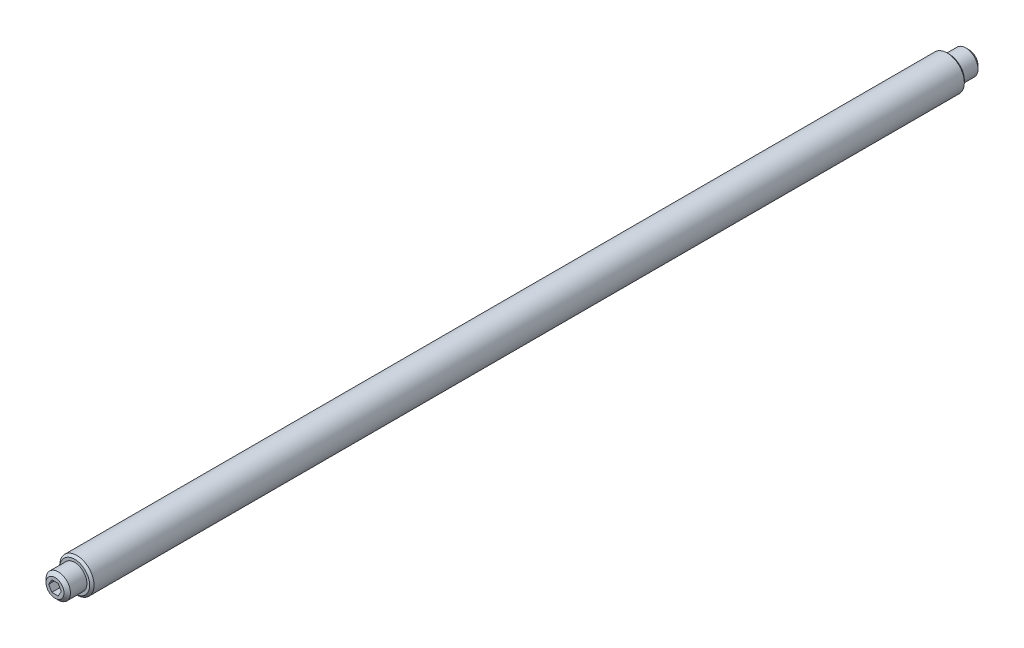
ISO-10303-21;
HEADER;
FILE_DESCRIPTION(('STEP AP214'),'2;1');
FILE_NAME('part.step','',(''),(''),'','','');
FILE_SCHEMA(('AUTOMOTIVE_DESIGN { 1 0 10303 214 1 1 1 1 }'));
ENDSEC;
DATA;
#1=APPLICATION_CONTEXT('core data for automotive mechanical design processes');
#2=APPLICATION_PROTOCOL_DEFINITION('international standard','automotive_design',2000,#1);
#3=PRODUCT_CONTEXT('',#1,'mechanical');
#4=PRODUCT('Part','Part','',(#3));
#5=PRODUCT_RELATED_PRODUCT_CATEGORY('part','',(#4));
#6=PRODUCT_DEFINITION_FORMATION('','',#4);
#7=PRODUCT_DEFINITION_CONTEXT('part definition',#1,'design');
#8=PRODUCT_DEFINITION('design','',#6,#7);
#9=PRODUCT_DEFINITION_SHAPE('','',#8);
#10=(LENGTH_UNIT() NAMED_UNIT(*) SI_UNIT(.MILLI.,.METRE.));
#11=(NAMED_UNIT(*) PLANE_ANGLE_UNIT() SI_UNIT($,.RADIAN.));
#12=(NAMED_UNIT(*) SI_UNIT($,.STERADIAN.) SOLID_ANGLE_UNIT());
#13=UNCERTAINTY_MEASURE_WITH_UNIT(LENGTH_MEASURE(1.E-05),#10,'distance_accuracy_value','');
#14=(GEOMETRIC_REPRESENTATION_CONTEXT(3) GLOBAL_UNCERTAINTY_ASSIGNED_CONTEXT((#13)) GLOBAL_UNIT_ASSIGNED_CONTEXT((#10,
#11,#12)) REPRESENTATION_CONTEXT('',''));
#15=CARTESIAN_POINT('',(0.,0.,0.));
#16=DIRECTION('',(0.,0.,1.));
#17=DIRECTION('',(1.,0.,0.));
#18=AXIS2_PLACEMENT_3D('',#15,#16,#17);
#19=CARTESIAN_POINT('',(0.,0.,-53.086));
#20=DIRECTION('',(0.,0.,-1.));
#21=DIRECTION('',(-0.99355881741134,0.113317590621135,0.));
#22=AXIS2_PLACEMENT_3D('',#19,#20,#21);
#23=PLANE('',#22);
#24=CARTESIAN_POINT('',(0.,0.,-53.086));
#25=DIRECTION('',(0.,0.,-1.));
#26=DIRECTION('',(-0.99355881741134,0.113317590621135,0.));
#27=AXIS2_PLACEMENT_3D('',#24,#25,#26);
#28=CIRCLE('',#27,1.04394);
#29=CARTESIAN_POINT('',(-1.0372157918484,0.118296765553028,-53.086));
#30=VERTEX_POINT('',#29);
#31=EDGE_CURVE('P0_E11',#30,#30,#28,.T.);
#32=ORIENTED_EDGE('',*,*,#31,.T.);
#33=EDGE_LOOP('',(#32));
#34=FACE_BOUND('',#33,.T.);
#35=DIRECTION('',(0.99355881741134,-0.113317590621135,0.));
#36=VECTOR('',#35,1.);
#37=CARTESIAN_POINT('',(-0.292299301142563,0.672454051876341,-53.086));
#38=LINE('',#37,#36);
#39=CARTESIAN_POINT('',(-0.292299301142563,0.672454051876341,-53.086));
#40=VERTEX_POINT('',#39);
#41=CARTESIAN_POINT('',(0.436212641231404,0.58936564623607,-53.086));
#42=VERTEX_POINT('',#41);
#43=EDGE_CURVE('P0_E78',#40,#42,#38,.T.);
#44=ORIENTED_EDGE('',*,*,#43,.F.);
#45=DIRECTION('',(-0.594915320879218,-0.803788380721678,0.));
#46=VECTOR('',#45,1.);
#47=CARTESIAN_POINT('',(-0.292299301142563,0.672454051876341,-53.086));
#48=LINE('',#47,#46);
#49=CARTESIAN_POINT('',(-0.728511942373968,0.0830884056402752,-53.086));
#50=VERTEX_POINT('',#49);
#51=EDGE_CURVE('P0_E31',#40,#50,#48,.T.);
#52=ORIENTED_EDGE('',*,*,#51,.T.);
#53=DIRECTION('',(-0.398643496532122,0.917105971342813,0.));
#54=VECTOR('',#53,1.);
#55=CARTESIAN_POINT('',(-0.436212641231405,-0.589365646236061,-53.086));
#56=LINE('',#55,#54);
#57=CARTESIAN_POINT('',(-0.436212641231405,-0.589365646236061,-53.086));
#58=VERTEX_POINT('',#57);
#59=EDGE_CURVE('P0_E84',#58,#50,#56,.T.);
#60=ORIENTED_EDGE('',*,*,#59,.F.);
#61=DIRECTION('',(0.99355881741134,-0.113317590621135,0.));
#62=VECTOR('',#61,1.);
#63=CARTESIAN_POINT('',(-0.436212641231405,-0.589365646236061,-53.086));
#64=LINE('',#63,#62);
#65=CARTESIAN_POINT('',(0.292299301142563,-0.672454051876332,-53.086));
#66=VERTEX_POINT('',#65);
#67=EDGE_CURVE('P0_E104',#58,#66,#64,.T.);
#68=ORIENTED_EDGE('',*,*,#67,.T.);
#69=DIRECTION('',(0.594915320879218,0.803788380721678,0.));
#70=VECTOR('',#69,1.);
#71=CARTESIAN_POINT('',(0.292299301142563,-0.672454051876332,-53.086));
#72=LINE('',#71,#70);
#73=CARTESIAN_POINT('',(0.728511942373967,-0.0830884056402665,-53.086));
#74=VERTEX_POINT('',#73);
#75=EDGE_CURVE('P0_E107',#66,#74,#72,.T.);
#76=ORIENTED_EDGE('',*,*,#75,.T.);
#77=DIRECTION('',(0.398643496532122,-0.917105971342813,0.));
#78=VECTOR('',#77,1.);
#79=CARTESIAN_POINT('',(0.436212641231404,0.58936564623607,-53.086));
#80=LINE('',#79,#78);
#81=EDGE_CURVE('P0_E110',#42,#74,#80,.T.);
#82=ORIENTED_EDGE('',*,*,#81,.F.);
#83=EDGE_LOOP('',(#44,#52,#60,#68,#76,#82));
#84=FACE_BOUND('',#83,.T.);
#85=ADVANCED_FACE('P0_F17',(#34,#84),#23,.T.);
#86=CARTESIAN_POINT('',(0.,0.,-53.086));
#87=DIRECTION('',(0.,0.,1.));
#88=DIRECTION('',(0.99355881741134,-0.113317590621135,0.));
#89=AXIS2_PLACEMENT_3D('',#86,#87,#88);
#90=CONICAL_SURFACE('',#89,1.04394,0.785398163397426);
#91=CARTESIAN_POINT('',(0.,0.,-52.70754));
#92=DIRECTION('',(0.,0.,-1.));
#93=DIRECTION('',(-0.99355881741134,0.113317590621135,0.));
#94=AXIS2_PLACEMENT_3D('',#91,#92,#93);
#95=CIRCLE('',#94,1.4224);
#96=CARTESIAN_POINT('',(-1.41323806188589,0.161182940899502,-52.70754));
#97=VERTEX_POINT('',#96);
#98=EDGE_CURVE('P0_E24',#97,#97,#95,.T.);
#99=ORIENTED_EDGE('',*,*,#98,.T.);
#100=EDGE_LOOP('',(#99));
#101=FACE_BOUND('',#100,.T.);
#102=ORIENTED_EDGE('',*,*,#31,.F.);
#103=EDGE_LOOP('',(#102));
#104=FACE_BOUND('',#103,.T.);
#105=ADVANCED_FACE('P0_F130',(#101,#104),#90,.T.);
#106=CARTESIAN_POINT('',(0.,0.,-65.786));
#107=DIRECTION('',(0.,0.,-1.));
#108=DIRECTION('',(-0.99355881741134,0.113317590621135,0.));
#109=AXIS2_PLACEMENT_3D('',#106,#107,#108);
#110=CYLINDRICAL_SURFACE('',#109,1.4224);
#111=CARTESIAN_POINT('',(0.,0.,-47.3837));
#112=DIRECTION('',(0.,0.,-1.));
#113=DIRECTION('',(-0.99355881741134,0.113317590621135,0.));
#114=AXIS2_PLACEMENT_3D('',#111,#112,#113);
#115=CIRCLE('',#114,1.4224);
#116=CARTESIAN_POINT('',(-1.41323806188589,0.161182940899502,-47.3837));
#117=VERTEX_POINT('',#116);
#118=EDGE_CURVE('P0_E125',#117,#117,#115,.T.);
#119=ORIENTED_EDGE('',*,*,#118,.T.);
#120=EDGE_LOOP('',(#119));
#121=FACE_BOUND('',#120,.T.);
#122=ORIENTED_EDGE('',*,*,#98,.F.);
#123=EDGE_LOOP('',(#122));
#124=FACE_BOUND('',#123,.T.);
#125=ADVANCED_FACE('P0_F133',(#121,#124),#110,.T.);
#126=CARTESIAN_POINT('',(0.,0.,-47.3837));
#127=DIRECTION('',(0.,0.,-1.));
#128=DIRECTION('',(-0.99355881741134,0.113317590621135,0.));
#129=AXIS2_PLACEMENT_3D('',#126,#127,#128);
#130=CONICAL_SURFACE('',#129,1.4224,0.785398163397453);
#131=CARTESIAN_POINT('',(0.,0.,-46.736));
#132=DIRECTION('',(0.,0.,-1.));
#133=DIRECTION('',(-0.99355881741134,0.113317590621135,0.));
#134=AXIS2_PLACEMENT_3D('',#131,#132,#133);
#135=CIRCLE('',#134,0.7747);
#136=CARTESIAN_POINT('',(-0.769710015848565,0.0877871374541932,-46.736));
#137=VERTEX_POINT('',#136);
#138=EDGE_CURVE('P0_E85',#137,#137,#135,.T.);
#139=ORIENTED_EDGE('',*,*,#138,.T.);
#140=EDGE_LOOP('',(#139));
#141=FACE_BOUND('',#140,.T.);
#142=ORIENTED_EDGE('',*,*,#118,.F.);
#143=EDGE_LOOP('',(#142));
#144=FACE_BOUND('',#143,.T.);
#145=ADVANCED_FACE('P0_F135',(#141,#144),#130,.T.);
#146=CARTESIAN_POINT('',(0.,0.,-47.2014867215606));
#147=DIRECTION('',(0.,0.,1.));
#148=DIRECTION('',(0.99355881741134,-0.113317590621135,0.));
#149=AXIS2_PLACEMENT_3D('',#146,#147,#148);
#150=CONICAL_SURFACE('',#149,0.,1.02974425867666);
#151=ORIENTED_EDGE('',*,*,#138,.F.);
#152=EDGE_LOOP('',(#151));
#153=FACE_BOUND('',#152,.T.);
#154=CARTESIAN_POINT('',(0.,0.,-47.2014867215606));
#155=VERTEX_POINT('',#154);
#156=VERTEX_LOOP('',#155);
#157=FACE_BOUND('',#156,.T.);
#158=ADVANCED_FACE('P0_F143',(#153,#157),#150,.F.);
#159=CARTESIAN_POINT('',(-0.292299301142563,0.672454051876341,-51.308));
#160=DIRECTION('',(0.803788380721678,-0.594915320879218,0.));
#161=DIRECTION('',(0.594915320879219,0.803788380721678,0.));
#162=AXIS2_PLACEMENT_3D('',#159,#160,#161);
#163=PLANE('',#162);
#164=ORIENTED_EDGE('',*,*,#51,.F.);
#165=DIRECTION('',(0.,0.,-1.));
#166=VECTOR('',#165,1.);
#167=CARTESIAN_POINT('',(-0.292299301142563,0.672454051876341,-51.308));
#168=LINE('',#167,#166);
#169=CARTESIAN_POINT('',(-0.292299301142563,0.672454051876341,-51.308));
#170=VERTEX_POINT('',#169);
#171=EDGE_CURVE('P0_E72',#170,#40,#168,.T.);
#172=ORIENTED_EDGE('',*,*,#171,.F.);
#173=DIRECTION('',(-0.594915320879218,-0.803788380721678,0.));
#174=VECTOR('',#173,1.);
#175=CARTESIAN_POINT('',(-0.292299301142563,0.672454051876341,-51.308));
#176=LINE('',#175,#174);
#177=CARTESIAN_POINT('',(-0.728511942373968,0.0830884056402752,-51.308));
#178=VERTEX_POINT('',#177);
#179=EDGE_CURVE('P0_E67',#170,#178,#176,.T.);
#180=ORIENTED_EDGE('',*,*,#179,.T.);
#181=DIRECTION('',(0.,0.,-1.));
#182=VECTOR('',#181,1.);
#183=CARTESIAN_POINT('',(-0.728511942373968,0.0830884056402752,-51.308));
#184=LINE('',#183,#182);
#185=EDGE_CURVE('P0_E70',#178,#50,#184,.T.);
#186=ORIENTED_EDGE('',*,*,#185,.T.);
#187=EDGE_LOOP('',(#164,#172,#180,#186));
#188=FACE_BOUND('',#187,.T.);
#189=ADVANCED_FACE('P0_F69',(#188),#163,.T.);
#190=CARTESIAN_POINT('',(-0.436212641231405,-0.589365646236061,-51.308));
#191=DIRECTION('',(-0.917105971342813,-0.398643496532122,0.));
#192=DIRECTION('',(0.398643496532122,-0.917105971342813,0.));
#193=AXIS2_PLACEMENT_3D('',#190,#191,#192);
#194=PLANE('',#193);
#195=ORIENTED_EDGE('',*,*,#59,.T.);
#196=ORIENTED_EDGE('',*,*,#185,.F.);
#197=DIRECTION('',(-0.398643496532122,0.917105971342813,0.));
#198=VECTOR('',#197,1.);
#199=CARTESIAN_POINT('',(-0.436212641231405,-0.589365646236061,-51.308));
#200=LINE('',#199,#198);
#201=CARTESIAN_POINT('',(-0.436212641231405,-0.589365646236061,-51.308));
#202=VERTEX_POINT('',#201);
#203=EDGE_CURVE('P0_E77',#202,#178,#200,.T.);
#204=ORIENTED_EDGE('',*,*,#203,.F.);
#205=DIRECTION('',(0.,0.,-1.));
#206=VECTOR('',#205,1.);
#207=CARTESIAN_POINT('',(-0.436212641231405,-0.589365646236061,-51.308));
#208=LINE('',#207,#206);
#209=EDGE_CURVE('P0_E86',#202,#58,#208,.T.);
#210=ORIENTED_EDGE('',*,*,#209,.T.);
#211=EDGE_LOOP('',(#195,#196,#204,#210));
#212=FACE_BOUND('',#211,.T.);
#213=ADVANCED_FACE('P0_F82',(#212),#194,.F.);
#214=CARTESIAN_POINT('',(-0.436212641231405,-0.589365646236061,-51.308));
#215=DIRECTION('',(0.113317590621135,0.99355881741134,0.));
#216=DIRECTION('',(-0.99355881741134,0.113317590621135,0.));
#217=AXIS2_PLACEMENT_3D('',#214,#215,#216);
#218=PLANE('',#217);
#219=ORIENTED_EDGE('',*,*,#67,.F.);
#220=ORIENTED_EDGE('',*,*,#209,.F.);
#221=DIRECTION('',(0.99355881741134,-0.113317590621135,0.));
#222=VECTOR('',#221,1.);
#223=CARTESIAN_POINT('',(-0.436212641231405,-0.589365646236061,-51.308));
#224=LINE('',#223,#222);
#225=CARTESIAN_POINT('',(0.292299301142563,-0.672454051876332,-51.308));
#226=VERTEX_POINT('',#225);
#227=EDGE_CURVE('P0_E91',#202,#226,#224,.T.);
#228=ORIENTED_EDGE('',*,*,#227,.T.);
#229=DIRECTION('',(0.,0.,-1.));
#230=VECTOR('',#229,1.);
#231=CARTESIAN_POINT('',(0.292299301142563,-0.672454051876332,-51.308));
#232=LINE('',#231,#230);
#233=EDGE_CURVE('P0_E120',#226,#66,#232,.T.);
#234=ORIENTED_EDGE('',*,*,#233,.T.);
#235=EDGE_LOOP('',(#219,#220,#228,#234));
#236=FACE_BOUND('',#235,.T.);
#237=ADVANCED_FACE('P0_F166',(#236),#218,.T.);
#238=CARTESIAN_POINT('',(0.292299301142563,-0.672454051876332,-51.308));
#239=DIRECTION('',(-0.803788380721678,0.594915320879218,0.));
#240=DIRECTION('',(-0.594915320879218,-0.803788380721678,0.));
#241=AXIS2_PLACEMENT_3D('',#238,#239,#240);
#242=PLANE('',#241);
#243=ORIENTED_EDGE('',*,*,#75,.F.);
#244=ORIENTED_EDGE('',*,*,#233,.F.);
#245=DIRECTION('',(0.594915320879218,0.803788380721678,0.));
#246=VECTOR('',#245,1.);
#247=CARTESIAN_POINT('',(0.292299301142563,-0.672454051876332,-51.308));
#248=LINE('',#247,#246);
#249=CARTESIAN_POINT('',(0.728511942373967,-0.0830884056402665,-51.308));
#250=VERTEX_POINT('',#249);
#251=EDGE_CURVE('P0_E93',#226,#250,#248,.T.);
#252=ORIENTED_EDGE('',*,*,#251,.T.);
#253=DIRECTION('',(0.,0.,-1.));
#254=VECTOR('',#253,1.);
#255=CARTESIAN_POINT('',(0.728511942373967,-0.0830884056402665,-51.308));
#256=LINE('',#255,#254);
#257=EDGE_CURVE('P0_E118',#250,#74,#256,.T.);
#258=ORIENTED_EDGE('',*,*,#257,.T.);
#259=EDGE_LOOP('',(#243,#244,#252,#258));
#260=FACE_BOUND('',#259,.T.);
#261=ADVANCED_FACE('P0_F162',(#260),#242,.T.);
#262=CARTESIAN_POINT('',(0.436212641231404,0.58936564623607,-51.308));
#263=DIRECTION('',(0.917105971342813,0.398643496532122,0.));
#264=DIRECTION('',(-0.398643496532122,0.917105971342813,0.));
#265=AXIS2_PLACEMENT_3D('',#262,#263,#264);
#266=PLANE('',#265);
#267=ORIENTED_EDGE('',*,*,#81,.T.);
#268=ORIENTED_EDGE('',*,*,#257,.F.);
#269=DIRECTION('',(0.398643496532122,-0.917105971342813,0.));
#270=VECTOR('',#269,1.);
#271=CARTESIAN_POINT('',(0.436212641231404,0.58936564623607,-51.308));
#272=LINE('',#271,#270);
#273=CARTESIAN_POINT('',(0.436212641231404,0.58936564623607,-51.308));
#274=VERTEX_POINT('',#273);
#275=EDGE_CURVE('P0_E97',#274,#250,#272,.T.);
#276=ORIENTED_EDGE('',*,*,#275,.F.);
#277=DIRECTION('',(0.,0.,-1.));
#278=VECTOR('',#277,1.);
#279=CARTESIAN_POINT('',(0.436212641231404,0.58936564623607,-51.308));
#280=LINE('',#279,#278);
#281=EDGE_CURVE('P0_E116',#274,#42,#280,.T.);
#282=ORIENTED_EDGE('',*,*,#281,.T.);
#283=EDGE_LOOP('',(#267,#268,#276,#282));
#284=FACE_BOUND('',#283,.T.);
#285=ADVANCED_FACE('P0_F159',(#284),#266,.F.);
#286=CARTESIAN_POINT('',(-0.292299301142563,0.672454051876341,-51.308));
#287=DIRECTION('',(0.113317590621135,0.99355881741134,0.));
#288=DIRECTION('',(-0.99355881741134,0.113317590621135,0.));
#289=AXIS2_PLACEMENT_3D('',#286,#287,#288);
#290=PLANE('',#289);
#291=ORIENTED_EDGE('',*,*,#43,.T.);
#292=ORIENTED_EDGE('',*,*,#281,.F.);
#293=DIRECTION('',(0.99355881741134,-0.113317590621135,0.));
#294=VECTOR('',#293,1.);
#295=CARTESIAN_POINT('',(-0.292299301142563,0.672454051876341,-51.308));
#296=LINE('',#295,#294);
#297=EDGE_CURVE('P0_E100',#170,#274,#296,.T.);
#298=ORIENTED_EDGE('',*,*,#297,.F.);
#299=ORIENTED_EDGE('',*,*,#171,.T.);
#300=EDGE_LOOP('',(#291,#292,#298,#299));
#301=FACE_BOUND('',#300,.T.);
#302=ADVANCED_FACE('P0_F155',(#301),#290,.F.);
#303=CARTESIAN_POINT('',(-0.728511942373968,0.0830884056402752,-51.308));
#304=DIRECTION('',(0.,0.,-1.));
#305=DIRECTION('',(-0.99355881741134,0.113317590621135,0.));
#306=AXIS2_PLACEMENT_3D('',#303,#304,#305);
#307=PLANE('',#306);
#308=ORIENTED_EDGE('',*,*,#179,.F.);
#309=ORIENTED_EDGE('',*,*,#297,.T.);
#310=ORIENTED_EDGE('',*,*,#275,.T.);
#311=ORIENTED_EDGE('',*,*,#251,.F.);
#312=ORIENTED_EDGE('',*,*,#227,.F.);
#313=ORIENTED_EDGE('',*,*,#203,.T.);
#314=EDGE_LOOP('',(#308,#309,#310,#311,#312,#313));
#315=FACE_BOUND('',#314,.T.);
#316=ADVANCED_FACE('P0_F89',(#315),#307,.T.);
#317=CLOSED_SHELL('',(#85,#105,#125,#145,#158,#189,#213,#237,#261,#285,#302,#316));
#318=MANIFOLD_SOLID_BREP('P0_B1',#317);
#319=CARTESIAN_POINT('',(0.,0.,50.8));
#320=DIRECTION('',(0.,0.,-1.));
#321=DIRECTION('',(-1.,0.,0.));
#322=AXIS2_PLACEMENT_3D('',#319,#320,#321);
#323=CYLINDRICAL_SURFACE('',#322,1.9939);
#324=CARTESIAN_POINT('',(0.,0.,-50.546));
#325=DIRECTION('',(0.,0.,1.));
#326=DIRECTION('',(1.,0.,0.));
#327=AXIS2_PLACEMENT_3D('',#324,#325,#326);
#328=CIRCLE('',#327,1.9939);
#329=CARTESIAN_POINT('',(1.9939,0.,-50.546));
#330=VERTEX_POINT('',#329);
#331=EDGE_CURVE('P1_E25',#330,#330,#328,.T.);
#332=ORIENTED_EDGE('',*,*,#331,.T.);
#333=EDGE_LOOP('',(#332));
#334=FACE_BOUND('',#333,.T.);
#335=CARTESIAN_POINT('',(0.,0.,50.546));
#336=DIRECTION('',(0.,0.,1.));
#337=DIRECTION('',(1.,0.,0.));
#338=AXIS2_PLACEMENT_3D('',#335,#336,#337);
#339=CIRCLE('',#338,1.9939);
#340=CARTESIAN_POINT('',(1.9939,0.,50.546));
#341=VERTEX_POINT('',#340);
#342=EDGE_CURVE('P1_E66',#341,#341,#339,.F.);
#343=ORIENTED_EDGE('',*,*,#342,.T.);
#344=EDGE_LOOP('',(#343));
#345=FACE_BOUND('',#344,.T.);
#346=ADVANCED_FACE('P1_F17',(#334,#345),#323,.T.);
#347=CARTESIAN_POINT('',(0.,0.,50.8));
#348=DIRECTION('',(0.,0.,1.));
#349=DIRECTION('',(1.,0.,0.));
#350=AXIS2_PLACEMENT_3D('',#347,#348,#349);
#351=PLANE('',#350);
#352=CARTESIAN_POINT('',(0.,0.,50.8));
#353=DIRECTION('',(0.,0.,1.));
#354=DIRECTION('',(1.,0.,0.));
#355=AXIS2_PLACEMENT_3D('',#352,#353,#354);
#356=CIRCLE('',#355,1.42239999999999);
#357=CARTESIAN_POINT('',(1.42239999999999,0.,50.8));
#358=VERTEX_POINT('',#357);
#359=EDGE_CURVE('P1_E60',#358,#358,#356,.T.);
#360=ORIENTED_EDGE('',*,*,#359,.F.);
#361=EDGE_LOOP('',(#360));
#362=FACE_BOUND('',#361,.T.);
#363=CARTESIAN_POINT('',(0.,0.,50.8));
#364=DIRECTION('',(0.,0.,1.));
#365=DIRECTION('',(1.,0.,0.));
#366=AXIS2_PLACEMENT_3D('',#363,#364,#365);
#367=CIRCLE('',#366,1.73989999999999);
#368=CARTESIAN_POINT('',(1.73989999999999,0.,50.8));
#369=VERTEX_POINT('',#368);
#370=EDGE_CURVE('P1_E63',#369,#369,#367,.T.);
#371=ORIENTED_EDGE('',*,*,#370,.T.);
#372=EDGE_LOOP('',(#371));
#373=FACE_BOUND('',#372,.T.);
#374=ADVANCED_FACE('P1_F90',(#362,#373),#351,.T.);
#375=CARTESIAN_POINT('',(0.,0.,-50.8));
#376=DIRECTION('',(0.,0.,1.));
#377=DIRECTION('',(1.,0.,0.));
#378=AXIS2_PLACEMENT_3D('',#375,#376,#377);
#379=PLANE('',#378);
#380=CARTESIAN_POINT('',(0.,0.,-50.8));
#381=DIRECTION('',(0.,0.,-1.));
#382=DIRECTION('',(-1.,0.,0.));
#383=AXIS2_PLACEMENT_3D('',#380,#381,#382);
#384=CIRCLE('',#383,1.42239999999999);
#385=CARTESIAN_POINT('',(-1.42239999999999,0.,-50.8));
#386=VERTEX_POINT('',#385);
#387=EDGE_CURVE('P1_E48',#386,#386,#384,.T.);
#388=ORIENTED_EDGE('',*,*,#387,.F.);
#389=EDGE_LOOP('',(#388));
#390=FACE_BOUND('',#389,.T.);
#391=CARTESIAN_POINT('',(0.,0.,-50.8));
#392=DIRECTION('',(0.,0.,1.));
#393=DIRECTION('',(1.,0.,0.));
#394=AXIS2_PLACEMENT_3D('',#391,#392,#393);
#395=CIRCLE('',#394,1.73990000000002);
#396=CARTESIAN_POINT('',(1.73990000000002,0.,-50.8));
#397=VERTEX_POINT('',#396);
#398=EDGE_CURVE('P1_E11',#397,#397,#395,.F.);
#399=ORIENTED_EDGE('',*,*,#398,.T.);
#400=EDGE_LOOP('',(#399));
#401=FACE_BOUND('',#400,.T.);
#402=ADVANCED_FACE('P1_F86',(#390,#401),#379,.F.);
#403=CARTESIAN_POINT('',(0.,0.,50.8));
#404=DIRECTION('',(0.,0.,-1.));
#405=DIRECTION('',(-1.,0.,0.));
#406=AXIS2_PLACEMENT_3D('',#403,#404,#405);
#407=CONICAL_SURFACE('',#406,1.73989999999999,0.785398163397462);
#408=ORIENTED_EDGE('',*,*,#342,.F.);
#409=EDGE_LOOP('',(#408));
#410=FACE_BOUND('',#409,.T.);
#411=ORIENTED_EDGE('',*,*,#370,.F.);
#412=EDGE_LOOP('',(#411));
#413=FACE_BOUND('',#412,.T.);
#414=ADVANCED_FACE('P1_F75',(#410,#413),#407,.T.);
#415=CARTESIAN_POINT('',(0.,0.,-50.546));
#416=DIRECTION('',(0.,0.,1.));
#417=DIRECTION('',(1.,0.,0.));
#418=AXIS2_PLACEMENT_3D('',#415,#416,#417);
#419=CONICAL_SURFACE('',#418,1.9939,0.785398163397435);
#420=ORIENTED_EDGE('',*,*,#398,.F.);
#421=EDGE_LOOP('',(#420));
#422=FACE_BOUND('',#421,.T.);
#423=ORIENTED_EDGE('',*,*,#331,.F.);
#424=EDGE_LOOP('',(#423));
#425=FACE_BOUND('',#424,.T.);
#426=ADVANCED_FACE('P1_F19',(#422,#425),#419,.T.);
#427=CARTESIAN_POINT('',(0.,0.,50.8));
#428=DIRECTION('',(0.,0.,1.));
#429=DIRECTION('',(1.,0.,0.));
#430=AXIS2_PLACEMENT_3D('',#427,#428,#429);
#431=CYLINDRICAL_SURFACE('',#430,1.4224);
#432=CARTESIAN_POINT('',(0.,0.,46.736));
#433=DIRECTION('',(0.,0.,1.));
#434=DIRECTION('',(1.,0.,0.));
#435=AXIS2_PLACEMENT_3D('',#432,#433,#434);
#436=CIRCLE('',#435,1.4224);
#437=CARTESIAN_POINT('',(1.4224,0.,46.736));
#438=VERTEX_POINT('',#437);
#439=EDGE_CURVE('P1_E57',#438,#438,#436,.T.);
#440=ORIENTED_EDGE('',*,*,#439,.F.);
#441=EDGE_LOOP('',(#440));
#442=FACE_BOUND('',#441,.T.);
#443=ORIENTED_EDGE('',*,*,#359,.T.);
#444=EDGE_LOOP('',(#443));
#445=FACE_BOUND('',#444,.T.);
#446=ADVANCED_FACE('P1_F74',(#442,#445),#431,.F.);
#447=CARTESIAN_POINT('',(1.1303,0.,46.736));
#448=DIRECTION('',(0.,0.,-1.));
#449=DIRECTION('',(-1.,0.,0.));
#450=AXIS2_PLACEMENT_3D('',#447,#448,#449);
#451=PLANE('',#450);
#452=CARTESIAN_POINT('',(0.,0.,46.736));
#453=DIRECTION('',(0.,0.,1.));
#454=DIRECTION('',(1.,0.,0.));
#455=AXIS2_PLACEMENT_3D('',#452,#453,#454);
#456=CIRCLE('',#455,1.1303);
#457=CARTESIAN_POINT('',(1.1303,0.,46.736));
#458=VERTEX_POINT('',#457);
#459=EDGE_CURVE('P1_E54',#458,#458,#456,.T.);
#460=ORIENTED_EDGE('',*,*,#459,.F.);
#461=EDGE_LOOP('',(#460));
#462=FACE_BOUND('',#461,.T.);
#463=ORIENTED_EDGE('',*,*,#439,.T.);
#464=EDGE_LOOP('',(#463));
#465=FACE_BOUND('',#464,.T.);
#466=ADVANCED_FACE('P1_F83',(#462,#465),#451,.F.);
#467=CARTESIAN_POINT('',(0.,0.,50.8));
#468=DIRECTION('',(0.,0.,1.));
#469=DIRECTION('',(1.,0.,0.));
#470=AXIS2_PLACEMENT_3D('',#467,#468,#469);
#471=CYLINDRICAL_SURFACE('',#470,1.1303);
#472=CARTESIAN_POINT('',(0.,0.,45.72));
#473=DIRECTION('',(0.,0.,1.));
#474=DIRECTION('',(1.,0.,0.));
#475=AXIS2_PLACEMENT_3D('',#472,#473,#474);
#476=CIRCLE('',#475,1.1303);
#477=CARTESIAN_POINT('',(1.1303,0.,45.72));
#478=VERTEX_POINT('',#477);
#479=EDGE_CURVE('P1_E51',#478,#478,#476,.T.);
#480=ORIENTED_EDGE('',*,*,#479,.F.);
#481=EDGE_LOOP('',(#480));
#482=FACE_BOUND('',#481,.T.);
#483=ORIENTED_EDGE('',*,*,#459,.T.);
#484=EDGE_LOOP('',(#483));
#485=FACE_BOUND('',#484,.T.);
#486=ADVANCED_FACE('P1_F104',(#482,#485),#471,.F.);
#487=CARTESIAN_POINT('',(0.,0.,45.72));
#488=DIRECTION('',(0.,0.,1.));
#489=DIRECTION('',(1.,0.,0.));
#490=AXIS2_PLACEMENT_3D('',#487,#488,#489);
#491=CONICAL_SURFACE('',#490,1.1303,1.02974425867665);
#492=CARTESIAN_POINT('',(0.,0.,45.0408472423131));
#493=VERTEX_POINT('',#492);
#494=VERTEX_LOOP('',#493);
#495=FACE_BOUND('',#494,.T.);
#496=ORIENTED_EDGE('',*,*,#479,.T.);
#497=EDGE_LOOP('',(#496));
#498=FACE_BOUND('',#497,.T.);
#499=ADVANCED_FACE('P1_F108',(#495,#498),#491,.F.);
#500=CARTESIAN_POINT('',(0.,0.,-50.8));
#501=DIRECTION('',(0.,0.,-1.));
#502=DIRECTION('',(-1.,0.,0.));
#503=AXIS2_PLACEMENT_3D('',#500,#501,#502);
#504=CYLINDRICAL_SURFACE('',#503,1.4224);
#505=CARTESIAN_POINT('',(0.,0.,-46.736));
#506=DIRECTION('',(0.,0.,-1.));
#507=DIRECTION('',(-1.,0.,0.));
#508=AXIS2_PLACEMENT_3D('',#505,#506,#507);
#509=CIRCLE('',#508,1.4224);
#510=CARTESIAN_POINT('',(-1.4224,0.,-46.736));
#511=VERTEX_POINT('',#510);
#512=EDGE_CURVE('P1_E43',#511,#511,#509,.T.);
#513=ORIENTED_EDGE('',*,*,#512,.F.);
#514=EDGE_LOOP('',(#513));
#515=FACE_BOUND('',#514,.T.);
#516=ORIENTED_EDGE('',*,*,#387,.T.);
#517=EDGE_LOOP('',(#516));
#518=FACE_BOUND('',#517,.T.);
#519=ADVANCED_FACE('P1_F112',(#515,#518),#504,.F.);
#520=CARTESIAN_POINT('',(1.1303,0.,-46.736));
#521=DIRECTION('',(0.,0.,1.));
#522=DIRECTION('',(1.,0.,0.));
#523=AXIS2_PLACEMENT_3D('',#520,#521,#522);
#524=PLANE('',#523);
#525=CARTESIAN_POINT('',(0.,0.,-46.736));
#526=DIRECTION('',(0.,0.,-1.));
#527=DIRECTION('',(-1.,0.,0.));
#528=AXIS2_PLACEMENT_3D('',#525,#526,#527);
#529=CIRCLE('',#528,1.1303);
#530=CARTESIAN_POINT('',(-1.1303,0.,-46.736));
#531=VERTEX_POINT('',#530);
#532=EDGE_CURVE('P1_E40',#531,#531,#529,.T.);
#533=ORIENTED_EDGE('',*,*,#532,.F.);
#534=EDGE_LOOP('',(#533));
#535=FACE_BOUND('',#534,.T.);
#536=ORIENTED_EDGE('',*,*,#512,.T.);
#537=EDGE_LOOP('',(#536));
#538=FACE_BOUND('',#537,.T.);
#539=ADVANCED_FACE('P1_F115',(#535,#538),#524,.F.);
#540=CARTESIAN_POINT('',(0.,0.,-50.8));
#541=DIRECTION('',(0.,0.,-1.));
#542=DIRECTION('',(-1.,0.,0.));
#543=AXIS2_PLACEMENT_3D('',#540,#541,#542);
#544=CYLINDRICAL_SURFACE('',#543,1.1303);
#545=CARTESIAN_POINT('',(0.,0.,-45.72));
#546=DIRECTION('',(0.,0.,-1.));
#547=DIRECTION('',(-1.,0.,0.));
#548=AXIS2_PLACEMENT_3D('',#545,#546,#547);
#549=CIRCLE('',#548,1.1303);
#550=CARTESIAN_POINT('',(-1.1303,0.,-45.72));
#551=VERTEX_POINT('',#550);
#552=EDGE_CURVE('P1_E38',#551,#551,#549,.T.);
#553=ORIENTED_EDGE('',*,*,#552,.F.);
#554=EDGE_LOOP('',(#553));
#555=FACE_BOUND('',#554,.T.);
#556=ORIENTED_EDGE('',*,*,#532,.T.);
#557=EDGE_LOOP('',(#556));
#558=FACE_BOUND('',#557,.T.);
#559=ADVANCED_FACE('P1_F34',(#555,#558),#544,.F.);
#560=CARTESIAN_POINT('',(0.,0.,-45.72));
#561=DIRECTION('',(0.,0.,-1.));
#562=DIRECTION('',(-1.,0.,0.));
#563=AXIS2_PLACEMENT_3D('',#560,#561,#562);
#564=CONICAL_SURFACE('',#563,1.1303,1.02974425867665);
#565=CARTESIAN_POINT('',(0.,0.,-45.0408472423131));
#566=VERTEX_POINT('',#565);
#567=VERTEX_LOOP('',#566);
#568=FACE_BOUND('',#567,.T.);
#569=ORIENTED_EDGE('',*,*,#552,.T.);
#570=EDGE_LOOP('',(#569));
#571=FACE_BOUND('',#570,.T.);
#572=ADVANCED_FACE('P1_F31',(#568,#571),#564,.F.);
#573=CLOSED_SHELL('',(#346,#374,#402,#414,#426,#446,#466,#486,#499,#519,#539,#559,#572));
#574=MANIFOLD_SOLID_BREP('P1_B1',#573);
#575=CARTESIAN_POINT('',(0.,0.,53.086));
#576=DIRECTION('',(0.,0.,1.));
#577=DIRECTION('',(0.999997633023904,-0.00217576344970809,0.));
#578=AXIS2_PLACEMENT_3D('',#575,#576,#577);
#579=PLANE('',#578);
#580=CARTESIAN_POINT('',(0.,0.,53.086));
#581=DIRECTION('',(0.,0.,1.));
#582=DIRECTION('',(0.999997633023904,-0.00217576344970809,0.));
#583=AXIS2_PLACEMENT_3D('',#580,#581,#582);
#584=CIRCLE('',#583,1.04394);
#585=CARTESIAN_POINT('',(1.04393752901897,-0.00227136649568899,53.086));
#586=VERTEX_POINT('',#585);
#587=EDGE_CURVE('P2_E10',#586,#586,#584,.T.);
#588=ORIENTED_EDGE('',*,*,#587,.T.);
#589=EDGE_LOOP('',(#588));
#590=FACE_BOUND('',#589,.T.);
#591=DIRECTION('',(-0.999997633023904,0.00217576344970794,0.));
#592=VECTOR('',#591,1.);
#593=CARTESIAN_POINT('',(0.367998162951304,0.634200824185685,53.086));
#594=LINE('',#593,#592);
#595=CARTESIAN_POINT('',(0.367998162951304,0.634200824185685,53.086));
#596=VERTEX_POINT('',#595);
#597=CARTESIAN_POINT('',(-0.365234943370178,0.63579616975468,53.086));
#598=VERTEX_POINT('',#597);
#599=EDGE_CURVE('P2_E77',#596,#598,#594,.T.);
#600=ORIENTED_EDGE('',*,*,#599,.F.);
#601=DIRECTION('',(0.49811455009188,-0.867111235647864,0.));
#602=VECTOR('',#601,1.);
#603=CARTESIAN_POINT('',(0.367998162951304,0.634200824185685,53.086));
#604=LINE('',#603,#602);
#605=CARTESIAN_POINT('',(0.73323310632148,-0.00159534556899138,53.086));
#606=VERTEX_POINT('',#605);
#607=EDGE_CURVE('P2_E30',#596,#606,#604,.T.);
#608=ORIENTED_EDGE('',*,*,#607,.T.);
#609=DIRECTION('',(0.501883082932025,0.864935472198155,0.));
#610=VECTOR('',#609,1.);
#611=CARTESIAN_POINT('',(0.365234943370175,-0.635796169754673,53.086));
#612=LINE('',#611,#610);
#613=CARTESIAN_POINT('',(0.365234943370175,-0.635796169754673,53.086));
#614=VERTEX_POINT('',#613);
#615=EDGE_CURVE('P2_E83',#614,#606,#612,.T.);
#616=ORIENTED_EDGE('',*,*,#615,.F.);
#617=DIRECTION('',(-0.999997633023904,0.00217576344970809,0.));
#618=VECTOR('',#617,1.);
#619=CARTESIAN_POINT('',(0.365234943370175,-0.635796169754673,53.086));
#620=LINE('',#619,#618);
#621=CARTESIAN_POINT('',(-0.367998162951307,-0.634200824185678,53.086));
#622=VERTEX_POINT('',#621);
#623=EDGE_CURVE('P2_E103',#614,#622,#620,.T.);
#624=ORIENTED_EDGE('',*,*,#623,.T.);
#625=DIRECTION('',(-0.498114550091879,0.867111235647864,0.));
#626=VECTOR('',#625,1.);
#627=CARTESIAN_POINT('',(-0.367998162951307,-0.634200824185678,53.086));
#628=LINE('',#627,#626);
#629=CARTESIAN_POINT('',(-0.733233106321483,0.00159534556899851,53.086));
#630=VERTEX_POINT('',#629);
#631=EDGE_CURVE('P2_E106',#622,#630,#628,.T.);
#632=ORIENTED_EDGE('',*,*,#631,.T.);
#633=DIRECTION('',(-0.501883082932025,-0.864935472198155,0.));
#634=VECTOR('',#633,1.);
#635=CARTESIAN_POINT('',(-0.365234943370178,0.63579616975468,53.086));
#636=LINE('',#635,#634);
#637=EDGE_CURVE('P2_E109',#598,#630,#636,.T.);
#638=ORIENTED_EDGE('',*,*,#637,.F.);
#639=EDGE_LOOP('',(#600,#608,#616,#624,#632,#638));
#640=FACE_BOUND('',#639,.T.);
#641=ADVANCED_FACE('P2_F16',(#590,#640),#579,.T.);
#642=CARTESIAN_POINT('',(0.,0.,53.086));
#643=DIRECTION('',(0.,0.,-1.));
#644=DIRECTION('',(-0.999997633023904,0.00217576344970809,0.));
#645=AXIS2_PLACEMENT_3D('',#642,#643,#644);
#646=CONICAL_SURFACE('',#645,1.04394,0.785398163397426);
#647=CARTESIAN_POINT('',(0.,0.,52.70754));
#648=DIRECTION('',(0.,0.,1.));
#649=DIRECTION('',(0.999997633023904,-0.00217576344970809,0.));
#650=AXIS2_PLACEMENT_3D('',#647,#648,#649);
#651=CIRCLE('',#650,1.4224);
#652=CARTESIAN_POINT('',(1.4223966332132,-0.00309480593086552,52.70754));
#653=VERTEX_POINT('',#652);
#654=EDGE_CURVE('P2_E23',#653,#653,#651,.T.);
#655=ORIENTED_EDGE('',*,*,#654,.T.);
#656=EDGE_LOOP('',(#655));
#657=FACE_BOUND('',#656,.T.);
#658=ORIENTED_EDGE('',*,*,#587,.F.);
#659=EDGE_LOOP('',(#658));
#660=FACE_BOUND('',#659,.T.);
#661=ADVANCED_FACE('P2_F129',(#657,#660),#646,.T.);
#662=CARTESIAN_POINT('',(0.,0.,65.786));
#663=DIRECTION('',(0.,0.,1.));
#664=DIRECTION('',(0.999997633023904,-0.00217576344970809,0.));
#665=AXIS2_PLACEMENT_3D('',#662,#663,#664);
#666=CYLINDRICAL_SURFACE('',#665,1.4224);
#667=CARTESIAN_POINT('',(0.,0.,47.3837));
#668=DIRECTION('',(0.,0.,1.));
#669=DIRECTION('',(0.999997633023904,-0.00217576344970809,0.));
#670=AXIS2_PLACEMENT_3D('',#667,#668,#669);
#671=CIRCLE('',#670,1.4224);
#672=CARTESIAN_POINT('',(1.4223966332132,-0.00309480593086552,47.3837));
#673=VERTEX_POINT('',#672);
#674=EDGE_CURVE('P2_E124',#673,#673,#671,.T.);
#675=ORIENTED_EDGE('',*,*,#674,.T.);
#676=EDGE_LOOP('',(#675));
#677=FACE_BOUND('',#676,.T.);
#678=ORIENTED_EDGE('',*,*,#654,.F.);
#679=EDGE_LOOP('',(#678));
#680=FACE_BOUND('',#679,.T.);
#681=ADVANCED_FACE('P2_F132',(#677,#680),#666,.T.);
#682=CARTESIAN_POINT('',(0.,0.,47.3837));
#683=DIRECTION('',(0.,0.,1.));
#684=DIRECTION('',(0.999997633023904,-0.00217576344970809,0.));
#685=AXIS2_PLACEMENT_3D('',#682,#683,#684);
#686=CONICAL_SURFACE('',#685,1.4224,0.785398163397453);
#687=CARTESIAN_POINT('',(0.,0.,46.736));
#688=DIRECTION('',(0.,0.,1.));
#689=DIRECTION('',(0.999997633023904,-0.00217576344970809,0.));
#690=AXIS2_PLACEMENT_3D('',#687,#688,#689);
#691=CIRCLE('',#690,0.7747);
#692=CARTESIAN_POINT('',(0.774698166303616,-0.00168556394448959,46.736));
#693=VERTEX_POINT('',#692);
#694=EDGE_CURVE('P2_E84',#693,#693,#691,.T.);
#695=ORIENTED_EDGE('',*,*,#694,.T.);
#696=EDGE_LOOP('',(#695));
#697=FACE_BOUND('',#696,.T.);
#698=ORIENTED_EDGE('',*,*,#674,.F.);
#699=EDGE_LOOP('',(#698));
#700=FACE_BOUND('',#699,.T.);
#701=ADVANCED_FACE('P2_F134',(#697,#700),#686,.T.);
#702=CARTESIAN_POINT('',(0.,0.,47.2014867215606));
#703=DIRECTION('',(0.,0.,-1.));
#704=DIRECTION('',(-0.999997633023904,0.00217576344970809,0.));
#705=AXIS2_PLACEMENT_3D('',#702,#703,#704);
#706=CONICAL_SURFACE('',#705,0.,1.02974425867666);
#707=ORIENTED_EDGE('',*,*,#694,.F.);
#708=EDGE_LOOP('',(#707));
#709=FACE_BOUND('',#708,.T.);
#710=CARTESIAN_POINT('',(0.,0.,47.2014867215606));
#711=VERTEX_POINT('',#710);
#712=VERTEX_LOOP('',#711);
#713=FACE_BOUND('',#712,.T.);
#714=ADVANCED_FACE('P2_F142',(#709,#713),#706,.F.);
#715=CARTESIAN_POINT('',(0.367998162951304,0.634200824185685,51.308));
#716=DIRECTION('',(-0.867111235647863,-0.498114550091879,0.));
#717=DIRECTION('',(-0.49811455009188,0.867111235647864,0.));
#718=AXIS2_PLACEMENT_3D('',#715,#716,#717);
#719=PLANE('',#718);
#720=ORIENTED_EDGE('',*,*,#607,.F.);
#721=DIRECTION('',(0.,0.,1.));
#722=VECTOR('',#721,1.);
#723=CARTESIAN_POINT('',(0.367998162951304,0.634200824185685,51.308));
#724=LINE('',#723,#722);
#725=CARTESIAN_POINT('',(0.367998162951304,0.634200824185685,51.308));
#726=VERTEX_POINT('',#725);
#727=EDGE_CURVE('P2_E71',#726,#596,#724,.T.);
#728=ORIENTED_EDGE('',*,*,#727,.F.);
#729=DIRECTION('',(0.49811455009188,-0.867111235647864,0.));
#730=VECTOR('',#729,1.);
#731=CARTESIAN_POINT('',(0.367998162951304,0.634200824185685,51.308));
#732=LINE('',#731,#730);
#733=CARTESIAN_POINT('',(0.73323310632148,-0.00159534556899138,51.308));
#734=VERTEX_POINT('',#733);
#735=EDGE_CURVE('P2_E66',#726,#734,#732,.T.);
#736=ORIENTED_EDGE('',*,*,#735,.T.);
#737=DIRECTION('',(0.,0.,1.));
#738=VECTOR('',#737,1.);
#739=CARTESIAN_POINT('',(0.73323310632148,-0.00159534556899138,51.308));
#740=LINE('',#739,#738);
#741=EDGE_CURVE('P2_E69',#734,#606,#740,.T.);
#742=ORIENTED_EDGE('',*,*,#741,.T.);
#743=EDGE_LOOP('',(#720,#728,#736,#742));
#744=FACE_BOUND('',#743,.T.);
#745=ADVANCED_FACE('P2_F68',(#744),#719,.T.);
#746=CARTESIAN_POINT('',(0.365234943370174,-0.635796169754673,51.308));
#747=DIRECTION('',(0.864935472198155,-0.501883082932025,0.));
#748=DIRECTION('',(-0.501883082932025,-0.864935472198155,0.));
#749=AXIS2_PLACEMENT_3D('',#746,#747,#748);
#750=PLANE('',#749);
#751=ORIENTED_EDGE('',*,*,#615,.T.);
#752=ORIENTED_EDGE('',*,*,#741,.F.);
#753=DIRECTION('',(0.501883082932025,0.864935472198155,0.));
#754=VECTOR('',#753,1.);
#755=CARTESIAN_POINT('',(0.365234943370174,-0.635796169754673,51.308));
#756=LINE('',#755,#754);
#757=CARTESIAN_POINT('',(0.365234943370174,-0.635796169754673,51.308));
#758=VERTEX_POINT('',#757);
#759=EDGE_CURVE('P2_E76',#758,#734,#756,.T.);
#760=ORIENTED_EDGE('',*,*,#759,.F.);
#761=DIRECTION('',(0.,0.,1.));
#762=VECTOR('',#761,1.);
#763=CARTESIAN_POINT('',(0.365234943370174,-0.635796169754673,51.308));
#764=LINE('',#763,#762);
#765=EDGE_CURVE('P2_E85',#758,#614,#764,.T.);
#766=ORIENTED_EDGE('',*,*,#765,.T.);
#767=EDGE_LOOP('',(#751,#752,#760,#766));
#768=FACE_BOUND('',#767,.T.);
#769=ADVANCED_FACE('P2_F81',(#768),#750,.F.);
#770=CARTESIAN_POINT('',(0.365234943370174,-0.635796169754673,51.308));
#771=DIRECTION('',(0.00217576344970802,0.999997633023904,0.));
#772=DIRECTION('',(0.999997633023904,-0.00217576344970809,0.));
#773=AXIS2_PLACEMENT_3D('',#770,#771,#772);
#774=PLANE('',#773);
#775=ORIENTED_EDGE('',*,*,#623,.F.);
#776=ORIENTED_EDGE('',*,*,#765,.F.);
#777=DIRECTION('',(-0.999997633023904,0.00217576344970809,0.));
#778=VECTOR('',#777,1.);
#779=CARTESIAN_POINT('',(0.365234943370174,-0.635796169754673,51.308));
#780=LINE('',#779,#778);
#781=CARTESIAN_POINT('',(-0.367998162951307,-0.634200824185678,51.308));
#782=VERTEX_POINT('',#781);
#783=EDGE_CURVE('P2_E90',#758,#782,#780,.T.);
#784=ORIENTED_EDGE('',*,*,#783,.T.);
#785=DIRECTION('',(0.,0.,1.));
#786=VECTOR('',#785,1.);
#787=CARTESIAN_POINT('',(-0.367998162951307,-0.634200824185678,51.308));
#788=LINE('',#787,#786);
#789=EDGE_CURVE('P2_E119',#782,#622,#788,.T.);
#790=ORIENTED_EDGE('',*,*,#789,.T.);
#791=EDGE_LOOP('',(#775,#776,#784,#790));
#792=FACE_BOUND('',#791,.T.);
#793=ADVANCED_FACE('P2_F165',(#792),#774,.T.);
#794=CARTESIAN_POINT('',(-0.367998162951307,-0.634200824185678,51.308));
#795=DIRECTION('',(0.867111235647864,0.498114550091879,0.));
#796=DIRECTION('',(0.498114550091879,-0.867111235647864,0.));
#797=AXIS2_PLACEMENT_3D('',#794,#795,#796);
#798=PLANE('',#797);
#799=ORIENTED_EDGE('',*,*,#631,.F.);
#800=ORIENTED_EDGE('',*,*,#789,.F.);
#801=DIRECTION('',(-0.498114550091879,0.867111235647864,0.));
#802=VECTOR('',#801,1.);
#803=CARTESIAN_POINT('',(-0.367998162951307,-0.634200824185678,51.308));
#804=LINE('',#803,#802);
#805=CARTESIAN_POINT('',(-0.733233106321483,0.00159534556899851,51.308));
#806=VERTEX_POINT('',#805);
#807=EDGE_CURVE('P2_E92',#782,#806,#804,.T.);
#808=ORIENTED_EDGE('',*,*,#807,.T.);
#809=DIRECTION('',(0.,0.,1.));
#810=VECTOR('',#809,1.);
#811=CARTESIAN_POINT('',(-0.733233106321483,0.00159534556899851,51.308));
#812=LINE('',#811,#810);
#813=EDGE_CURVE('P2_E117',#806,#630,#812,.T.);
#814=ORIENTED_EDGE('',*,*,#813,.T.);
#815=EDGE_LOOP('',(#799,#800,#808,#814));
#816=FACE_BOUND('',#815,.T.);
#817=ADVANCED_FACE('P2_F161',(#816),#798,.T.);
#818=CARTESIAN_POINT('',(-0.365234943370178,0.63579616975468,51.308));
#819=DIRECTION('',(-0.864935472198156,0.501883082932025,0.));
#820=DIRECTION('',(0.501883082932025,0.864935472198155,0.));
#821=AXIS2_PLACEMENT_3D('',#818,#819,#820);
#822=PLANE('',#821);
#823=ORIENTED_EDGE('',*,*,#637,.T.);
#824=ORIENTED_EDGE('',*,*,#813,.F.);
#825=DIRECTION('',(-0.501883082932025,-0.864935472198155,0.));
#826=VECTOR('',#825,1.);
#827=CARTESIAN_POINT('',(-0.365234943370178,0.63579616975468,51.308));
#828=LINE('',#827,#826);
#829=CARTESIAN_POINT('',(-0.365234943370178,0.63579616975468,51.308));
#830=VERTEX_POINT('',#829);
#831=EDGE_CURVE('P2_E96',#830,#806,#828,.T.);
#832=ORIENTED_EDGE('',*,*,#831,.F.);
#833=DIRECTION('',(0.,0.,1.));
#834=VECTOR('',#833,1.);
#835=CARTESIAN_POINT('',(-0.365234943370178,0.63579616975468,51.308));
#836=LINE('',#835,#834);
#837=EDGE_CURVE('P2_E115',#830,#598,#836,.T.);
#838=ORIENTED_EDGE('',*,*,#837,.T.);
#839=EDGE_LOOP('',(#823,#824,#832,#838));
#840=FACE_BOUND('',#839,.T.);
#841=ADVANCED_FACE('P2_F158',(#840),#822,.F.);
#842=CARTESIAN_POINT('',(0.367998162951304,0.634200824185685,51.308));
#843=DIRECTION('',(0.00217576344970787,0.999997633023904,0.));
#844=DIRECTION('',(0.999997633023904,-0.00217576344970794,0.));
#845=AXIS2_PLACEMENT_3D('',#842,#843,#844);
#846=PLANE('',#845);
#847=ORIENTED_EDGE('',*,*,#599,.T.);
#848=ORIENTED_EDGE('',*,*,#837,.F.);
#849=DIRECTION('',(-0.999997633023904,0.00217576344970794,0.));
#850=VECTOR('',#849,1.);
#851=CARTESIAN_POINT('',(0.367998162951304,0.634200824185685,51.308));
#852=LINE('',#851,#850);
#853=EDGE_CURVE('P2_E99',#726,#830,#852,.T.);
#854=ORIENTED_EDGE('',*,*,#853,.F.);
#855=ORIENTED_EDGE('',*,*,#727,.T.);
#856=EDGE_LOOP('',(#847,#848,#854,#855));
#857=FACE_BOUND('',#856,.T.);
#858=ADVANCED_FACE('P2_F154',(#857),#846,.F.);
#859=CARTESIAN_POINT('',(0.73323310632148,-0.00159534556899132,51.308));
#860=DIRECTION('',(0.,0.,1.));
#861=DIRECTION('',(0.999997633023904,-0.00217576344970809,0.));
#862=AXIS2_PLACEMENT_3D('',#859,#860,#861);
#863=PLANE('',#862);
#864=ORIENTED_EDGE('',*,*,#735,.F.);
#865=ORIENTED_EDGE('',*,*,#853,.T.);
#866=ORIENTED_EDGE('',*,*,#831,.T.);
#867=ORIENTED_EDGE('',*,*,#807,.F.);
#868=ORIENTED_EDGE('',*,*,#783,.F.);
#869=ORIENTED_EDGE('',*,*,#759,.T.);
#870=EDGE_LOOP('',(#864,#865,#866,#867,#868,#869));
#871=FACE_BOUND('',#870,.T.);
#872=ADVANCED_FACE('P2_F88',(#871),#863,.T.);
#873=CLOSED_SHELL('',(#641,#661,#681,#701,#714,#745,#769,#793,#817,#841,#858,#872));
#874=MANIFOLD_SOLID_BREP('P2_B1',#873);
#875=ADVANCED_BREP_SHAPE_REPRESENTATION('',(#18,#318,#574,#874),#14);
#876=SHAPE_DEFINITION_REPRESENTATION(#9,#875);
ENDSEC;
END-ISO-10303-21;
